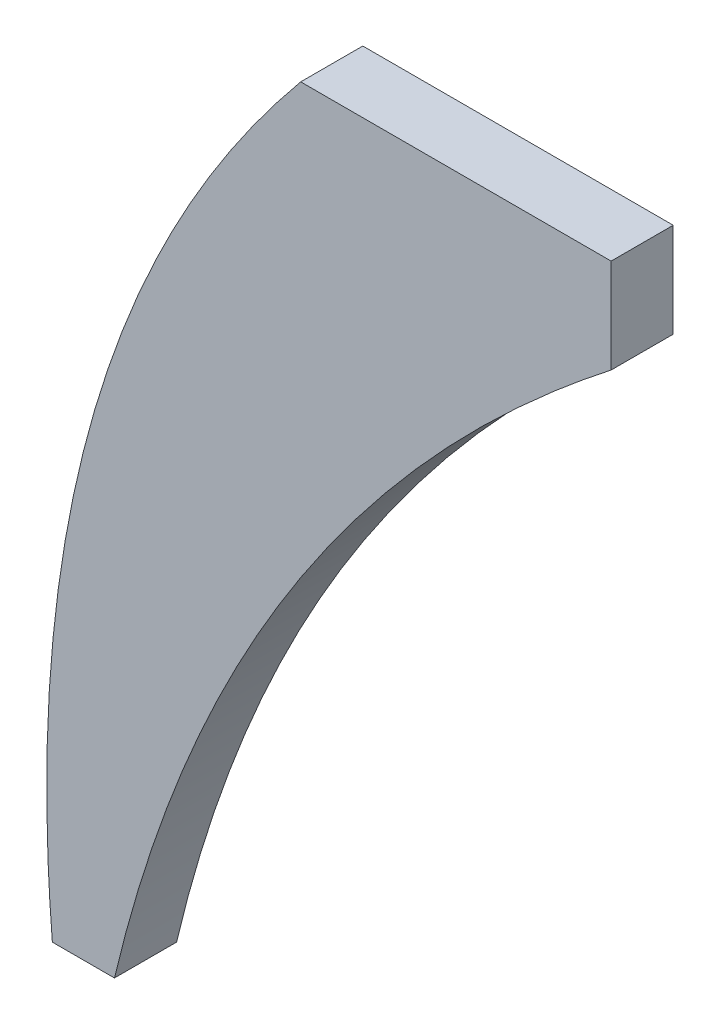
ISO-10303-21;
HEADER;
FILE_DESCRIPTION(('STEP AP214'),'2;1');
FILE_NAME('part.step','',(''),(''),'','','');
FILE_SCHEMA(('AUTOMOTIVE_DESIGN { 1 0 10303 214 1 1 1 1 }'));
ENDSEC;
DATA;
#1=APPLICATION_CONTEXT('core data for automotive mechanical design processes');
#2=APPLICATION_PROTOCOL_DEFINITION('international standard','automotive_design',2000,#1);
#3=PRODUCT_CONTEXT('',#1,'mechanical');
#4=PRODUCT('Part','Part','',(#3));
#5=PRODUCT_RELATED_PRODUCT_CATEGORY('part','',(#4));
#6=PRODUCT_DEFINITION_FORMATION('','',#4);
#7=PRODUCT_DEFINITION_CONTEXT('part definition',#1,'design');
#8=PRODUCT_DEFINITION('design','',#6,#7);
#9=PRODUCT_DEFINITION_SHAPE('','',#8);
#10=(LENGTH_UNIT() NAMED_UNIT(*) SI_UNIT(.MILLI.,.METRE.));
#11=(NAMED_UNIT(*) PLANE_ANGLE_UNIT() SI_UNIT($,.RADIAN.));
#12=(NAMED_UNIT(*) SI_UNIT($,.STERADIAN.) SOLID_ANGLE_UNIT());
#13=UNCERTAINTY_MEASURE_WITH_UNIT(LENGTH_MEASURE(1.E-05),#10,'distance_accuracy_value','');
#14=(GEOMETRIC_REPRESENTATION_CONTEXT(3) GLOBAL_UNCERTAINTY_ASSIGNED_CONTEXT((#13)) GLOBAL_UNIT_ASSIGNED_CONTEXT((#10,
#11,#12)) REPRESENTATION_CONTEXT('',''));
#15=CARTESIAN_POINT('',(0.,0.,0.));
#16=DIRECTION('',(0.,0.,1.));
#17=DIRECTION('',(1.,0.,0.));
#18=AXIS2_PLACEMENT_3D('',#15,#16,#17);
#19=CARTESIAN_POINT('',(-89.3953245312719,-2.46642983814382E-11,5.));
#20=CARTESIAN_POINT('',(-112.892623639686,-28.4442269061744,5.));
#21=CARTESIAN_POINT('',(-109.395324531272,-70.0000000000247,5.));
#22=B_SPLINE_CURVE_WITH_KNOTS('',2,(#19,#20,#21),.UNSPECIFIED.,.F.,.F.,(3,3),(0.,1.),.UNSPECIFIED.);
#23=DIRECTION('',(0.,0.,-1.));
#24=VECTOR('',#23,1.);
#25=SURFACE_OF_LINEAR_EXTRUSION('',#22,#24);
#26=CARTESIAN_POINT('',(-89.3953245312719,-2.46642983814382E-11,0.));
#27=CARTESIAN_POINT('',(-112.892623639686,-28.4442269061744,0.));
#28=CARTESIAN_POINT('',(-109.395324531272,-70.0000000000247,0.));
#29=B_SPLINE_CURVE_WITH_KNOTS('',2,(#26,#27,#28),.UNSPECIFIED.,.F.,.F.,(3,3),(0.,1.),.UNSPECIFIED.);
#30=CARTESIAN_POINT('',(-89.3953245312719,-2.46642983814382E-11,0.));
#31=VERTEX_POINT('',#30);
#32=CARTESIAN_POINT('',(-109.395324531272,-70.0000000000247,0.));
#33=VERTEX_POINT('',#32);
#34=EDGE_CURVE('E108',#31,#33,#29,.T.);
#35=ORIENTED_EDGE('',*,*,#34,.T.);
#36=DIRECTION('',(0.,0.,-1.));
#37=VECTOR('',#36,1.);
#38=CARTESIAN_POINT('',(-109.395324531272,-70.0000000000247,5.));
#39=LINE('',#38,#37);
#40=CARTESIAN_POINT('',(-109.395324531272,-70.0000000000247,5.));
#41=VERTEX_POINT('',#40);
#42=EDGE_CURVE('E11',#41,#33,#39,.T.);
#43=ORIENTED_EDGE('',*,*,#42,.F.);
#44=CARTESIAN_POINT('',(-89.3953245312719,-2.46642983814382E-11,5.));
#45=VERTEX_POINT('',#44);
#46=EDGE_CURVE('E126',#45,#41,#22,.T.);
#47=ORIENTED_EDGE('',*,*,#46,.F.);
#48=DIRECTION('',(0.,0.,-1.));
#49=VECTOR('',#48,1.);
#50=CARTESIAN_POINT('',(-89.3953245312719,-2.46642983814382E-11,5.));
#51=LINE('',#50,#49);
#52=EDGE_CURVE('E101',#45,#31,#51,.T.);
#53=ORIENTED_EDGE('',*,*,#52,.T.);
#54=EDGE_LOOP('',(#35,#43,#47,#53));
#55=FACE_BOUND('',#54,.T.);
#56=ADVANCED_FACE('F30',(#55),#25,.F.);
#57=CARTESIAN_POINT('',(-109.395324531272,-70.0000000000247,5.));
#58=DIRECTION('',(0.,1.,0.));
#59=DIRECTION('',(0.,0.,1.));
#60=AXIS2_PLACEMENT_3D('',#57,#58,#59);
#61=PLANE('',#60);
#62=DIRECTION('',(1.,0.,0.));
#63=VECTOR('',#62,1.);
#64=CARTESIAN_POINT('',(-109.395324531272,-70.0000000000247,0.));
#65=LINE('',#64,#63);
#66=CARTESIAN_POINT('',(-104.395324531272,-70.0000000000247,0.));
#67=VERTEX_POINT('',#66);
#68=EDGE_CURVE('E113',#33,#67,#65,.T.);
#69=ORIENTED_EDGE('',*,*,#68,.T.);
#70=DIRECTION('',(0.,0.,-1.));
#71=VECTOR('',#70,1.);
#72=CARTESIAN_POINT('',(-104.395324531272,-70.0000000000247,5.));
#73=LINE('',#72,#71);
#74=CARTESIAN_POINT('',(-104.395324531272,-70.0000000000247,5.));
#75=VERTEX_POINT('',#74);
#76=EDGE_CURVE('E39',#75,#67,#73,.T.);
#77=ORIENTED_EDGE('',*,*,#76,.F.);
#78=DIRECTION('',(1.,0.,0.));
#79=VECTOR('',#78,1.);
#80=CARTESIAN_POINT('',(-109.395324531272,-70.0000000000247,5.));
#81=LINE('',#80,#79);
#82=EDGE_CURVE('E81',#41,#75,#81,.T.);
#83=ORIENTED_EDGE('',*,*,#82,.F.);
#84=ORIENTED_EDGE('',*,*,#42,.T.);
#85=EDGE_LOOP('',(#69,#77,#83,#84));
#86=FACE_BOUND('',#85,.T.);
#87=ADVANCED_FACE('F146',(#86),#61,.F.);
#88=CARTESIAN_POINT('',(-104.395324531272,-70.0000000000247,5.));
#89=CARTESIAN_POINT('',(-95.3050164549791,-31.7454682686793,5.));
#90=CARTESIAN_POINT('',(-64.3953245312719,-7.60000000002466,5.));
#91=B_SPLINE_CURVE_WITH_KNOTS('',2,(#88,#89,#90),.UNSPECIFIED.,.F.,.F.,(3,3),(0.,1.),.UNSPECIFIED.);
#92=DIRECTION('',(0.,0.,-1.));
#93=VECTOR('',#92,1.);
#94=SURFACE_OF_LINEAR_EXTRUSION('',#91,#93);
#95=CARTESIAN_POINT('',(-104.395324531272,-70.0000000000247,0.));
#96=CARTESIAN_POINT('',(-95.3050164549791,-31.7454682686793,0.));
#97=CARTESIAN_POINT('',(-64.3953245312719,-7.60000000002466,0.));
#98=B_SPLINE_CURVE_WITH_KNOTS('',2,(#95,#96,#97),.UNSPECIFIED.,.F.,.F.,(3,3),(0.,1.),.UNSPECIFIED.);
#99=CARTESIAN_POINT('',(-64.3953245312719,-7.60000000002466,0.));
#100=VERTEX_POINT('',#99);
#101=EDGE_CURVE('E96',#67,#100,#98,.T.);
#102=ORIENTED_EDGE('',*,*,#101,.T.);
#103=DIRECTION('',(0.,0.,-1.));
#104=VECTOR('',#103,1.);
#105=CARTESIAN_POINT('',(-64.3953245312719,-7.60000000002466,5.));
#106=LINE('',#105,#104);
#107=CARTESIAN_POINT('',(-64.3953245312719,-7.60000000002466,5.));
#108=VERTEX_POINT('',#107);
#109=EDGE_CURVE('E93',#108,#100,#106,.T.);
#110=ORIENTED_EDGE('',*,*,#109,.F.);
#111=EDGE_CURVE('E85',#75,#108,#91,.T.);
#112=ORIENTED_EDGE('',*,*,#111,.F.);
#113=ORIENTED_EDGE('',*,*,#76,.T.);
#114=EDGE_LOOP('',(#102,#110,#112,#113));
#115=FACE_BOUND('',#114,.T.);
#116=ADVANCED_FACE('F94',(#115),#94,.F.);
#117=CARTESIAN_POINT('',(-64.3953245312719,-2.46642983814382E-11,5.));
#118=DIRECTION('',(-1.,0.,0.));
#119=DIRECTION('',(0.,0.,1.));
#120=AXIS2_PLACEMENT_3D('',#117,#118,#119);
#121=PLANE('',#120);
#122=DIRECTION('',(0.,1.,0.));
#123=VECTOR('',#122,1.);
#124=CARTESIAN_POINT('',(-64.3953245312719,-2.46642983814382E-11,0.));
#125=LINE('',#124,#123);
#126=CARTESIAN_POINT('',(-64.3953245312719,-2.46642983814382E-11,0.));
#127=VERTEX_POINT('',#126);
#128=EDGE_CURVE('E67',#100,#127,#125,.T.);
#129=ORIENTED_EDGE('',*,*,#128,.T.);
#130=DIRECTION('',(0.,0.,-1.));
#131=VECTOR('',#130,1.);
#132=CARTESIAN_POINT('',(-64.3953245312719,-2.46642983814382E-11,5.));
#133=LINE('',#132,#131);
#134=CARTESIAN_POINT('',(-64.3953245312719,-2.46642983814382E-11,5.));
#135=VERTEX_POINT('',#134);
#136=EDGE_CURVE('E97',#135,#127,#133,.T.);
#137=ORIENTED_EDGE('',*,*,#136,.F.);
#138=DIRECTION('',(0.,1.,0.));
#139=VECTOR('',#138,1.);
#140=CARTESIAN_POINT('',(-64.3953245312719,-2.46642983814382E-11,5.));
#141=LINE('',#140,#139);
#142=EDGE_CURVE('E89',#108,#135,#141,.T.);
#143=ORIENTED_EDGE('',*,*,#142,.F.);
#144=ORIENTED_EDGE('',*,*,#109,.T.);
#145=EDGE_LOOP('',(#129,#137,#143,#144));
#146=FACE_BOUND('',#145,.T.);
#147=ADVANCED_FACE('F99',(#146),#121,.F.);
#148=CARTESIAN_POINT('',(-89.3953245312719,-2.46642983814382E-11,5.));
#149=DIRECTION('',(0.,-1.,0.));
#150=DIRECTION('',(0.,0.,-1.));
#151=AXIS2_PLACEMENT_3D('',#148,#149,#150);
#152=PLANE('',#151);
#153=DIRECTION('',(-1.,0.,0.));
#154=VECTOR('',#153,1.);
#155=CARTESIAN_POINT('',(-89.3953245312719,-2.46642983814382E-11,0.));
#156=LINE('',#155,#154);
#157=EDGE_CURVE('E73',#127,#31,#156,.T.);
#158=ORIENTED_EDGE('',*,*,#157,.T.);
#159=ORIENTED_EDGE('',*,*,#52,.F.);
#160=DIRECTION('',(-1.,0.,0.));
#161=VECTOR('',#160,1.);
#162=CARTESIAN_POINT('',(-89.3953245312719,-2.46642983814382E-11,5.));
#163=LINE('',#162,#161);
#164=EDGE_CURVE('E47',#135,#45,#163,.T.);
#165=ORIENTED_EDGE('',*,*,#164,.F.);
#166=ORIENTED_EDGE('',*,*,#136,.T.);
#167=EDGE_LOOP('',(#158,#159,#165,#166));
#168=FACE_BOUND('',#167,.T.);
#169=ADVANCED_FACE('F134',(#168),#152,.F.);
#170=CARTESIAN_POINT('',(-106.143974085479,-31.7221134530995,5.));
#171=DIRECTION('',(0.,0.,-1.));
#172=DIRECTION('',(-1.,0.,0.));
#173=AXIS2_PLACEMENT_3D('',#170,#171,#172);
#174=PLANE('',#173);
#175=ORIENTED_EDGE('',*,*,#46,.T.);
#176=ORIENTED_EDGE('',*,*,#82,.T.);
#177=ORIENTED_EDGE('',*,*,#111,.T.);
#178=ORIENTED_EDGE('',*,*,#142,.T.);
#179=ORIENTED_EDGE('',*,*,#164,.T.);
#180=EDGE_LOOP('',(#175,#176,#177,#178,#179));
#181=FACE_BOUND('',#180,.T.);
#182=ADVANCED_FACE('F87',(#181),#174,.F.);
#183=CARTESIAN_POINT('',(-106.143974085479,-31.7221134530995,0.));
#184=DIRECTION('',(0.,0.,-1.));
#185=DIRECTION('',(-1.,0.,0.));
#186=AXIS2_PLACEMENT_3D('',#183,#184,#185);
#187=PLANE('',#186);
#188=ORIENTED_EDGE('',*,*,#34,.F.);
#189=ORIENTED_EDGE('',*,*,#157,.F.);
#190=ORIENTED_EDGE('',*,*,#128,.F.);
#191=ORIENTED_EDGE('',*,*,#101,.F.);
#192=ORIENTED_EDGE('',*,*,#68,.F.);
#193=EDGE_LOOP('',(#188,#189,#190,#191,#192));
#194=FACE_BOUND('',#193,.T.);
#195=ADVANCED_FACE('F130',(#194),#187,.T.);
#196=CLOSED_SHELL('',(#56,#87,#116,#147,#169,#182,#195));
#197=MANIFOLD_SOLID_BREP('B2',#196);
#198=ADVANCED_BREP_SHAPE_REPRESENTATION('',(#18,#197),#14);
#199=SHAPE_DEFINITION_REPRESENTATION(#9,#198);
ENDSEC;
END-ISO-10303-21;
